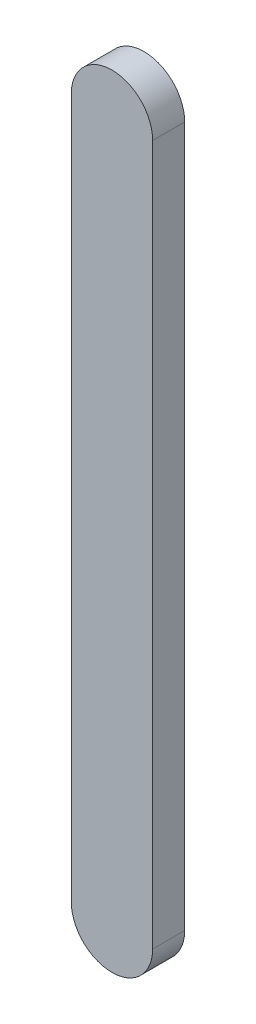
ISO-10303-21;
HEADER;
FILE_DESCRIPTION(('STEP AP214'),'2;1');
FILE_NAME('part.step','',(''),(''),'','','');
FILE_SCHEMA(('AUTOMOTIVE_DESIGN { 1 0 10303 214 1 1 1 1 }'));
ENDSEC;
DATA;
#1=APPLICATION_CONTEXT('core data for automotive mechanical design processes');
#2=APPLICATION_PROTOCOL_DEFINITION('international standard','automotive_design',2000,#1);
#3=PRODUCT_CONTEXT('',#1,'mechanical');
#4=PRODUCT('Part','Part','',(#3));
#5=PRODUCT_RELATED_PRODUCT_CATEGORY('part','',(#4));
#6=PRODUCT_DEFINITION_FORMATION('','',#4);
#7=PRODUCT_DEFINITION_CONTEXT('part definition',#1,'design');
#8=PRODUCT_DEFINITION('design','',#6,#7);
#9=PRODUCT_DEFINITION_SHAPE('','',#8);
#10=(LENGTH_UNIT() NAMED_UNIT(*) SI_UNIT(.MILLI.,.METRE.));
#11=(NAMED_UNIT(*) PLANE_ANGLE_UNIT() SI_UNIT($,.RADIAN.));
#12=(NAMED_UNIT(*) SI_UNIT($,.STERADIAN.) SOLID_ANGLE_UNIT());
#13=UNCERTAINTY_MEASURE_WITH_UNIT(LENGTH_MEASURE(1.E-05),#10,'distance_accuracy_value','');
#14=(GEOMETRIC_REPRESENTATION_CONTEXT(3) GLOBAL_UNCERTAINTY_ASSIGNED_CONTEXT((#13)) GLOBAL_UNIT_ASSIGNED_CONTEXT((#10,
#11,#12)) REPRESENTATION_CONTEXT('',''));
#15=CARTESIAN_POINT('',(0.,0.,0.));
#16=DIRECTION('',(0.,0.,1.));
#17=DIRECTION('',(1.,0.,0.));
#18=AXIS2_PLACEMENT_3D('',#15,#16,#17);
#19=CARTESIAN_POINT('',(147.8788,102.4352028,0.));
#20=DIRECTION('',(-1.,0.,0.));
#21=DIRECTION('',(0.,1.,0.));
#22=AXIS2_PLACEMENT_3D('',#19,#20,#21);
#23=PLANE('',#22);
#24=DIRECTION('',(0.,1.,0.));
#25=VECTOR('',#24,1.);
#26=CARTESIAN_POINT('',(147.8788,102.4352028,0.1999996));
#27=LINE('',#26,#25);
#28=CARTESIAN_POINT('',(147.8788,102.4352028,0.1999996));
#29=VERTEX_POINT('',#28);
#30=CARTESIAN_POINT('',(147.8788,106.807,0.1999996));
#31=VERTEX_POINT('',#30);
#32=EDGE_CURVE('E11',#29,#31,#27,.T.);
#33=ORIENTED_EDGE('',*,*,#32,.F.);
#34=DIRECTION('',(0.,0.,1.));
#35=VECTOR('',#34,1.);
#36=CARTESIAN_POINT('',(147.8788,102.4352028,0.));
#37=LINE('',#36,#35);
#38=CARTESIAN_POINT('',(147.8788,102.4352028,0.));
#39=VERTEX_POINT('',#38);
#40=EDGE_CURVE('E24',#39,#29,#37,.T.);
#41=ORIENTED_EDGE('',*,*,#40,.F.);
#42=DIRECTION('',(0.,1.,0.));
#43=VECTOR('',#42,1.);
#44=CARTESIAN_POINT('',(147.8788,102.4352028,0.));
#45=LINE('',#44,#43);
#46=CARTESIAN_POINT('',(147.8788,106.807,0.));
#47=VERTEX_POINT('',#46);
#48=EDGE_CURVE('E75',#39,#47,#45,.T.);
#49=ORIENTED_EDGE('',*,*,#48,.T.);
#50=DIRECTION('',(0.,0.,1.));
#51=VECTOR('',#50,1.);
#52=CARTESIAN_POINT('',(147.8788,106.807,0.));
#53=LINE('',#52,#51);
#54=EDGE_CURVE('E37',#47,#31,#53,.T.);
#55=ORIENTED_EDGE('',*,*,#54,.T.);
#56=EDGE_LOOP('',(#33,#41,#49,#55));
#57=FACE_BOUND('',#56,.T.);
#58=ADVANCED_FACE('F17',(#57),#23,.F.);
#59=CARTESIAN_POINT('',(147.6248,106.807,0.));
#60=DIRECTION('',(0.,0.,-1.));
#61=DIRECTION('',(1.,0.,0.));
#62=AXIS2_PLACEMENT_3D('',#59,#60,#61);
#63=CYLINDRICAL_SURFACE('',#62,0.25400000000001);
#64=CARTESIAN_POINT('',(147.6248,106.807,0.1999996));
#65=DIRECTION('',(0.,0.,1.));
#66=DIRECTION('',(1.,0.,0.));
#67=AXIS2_PLACEMENT_3D('',#64,#65,#66);
#68=CIRCLE('',#67,0.25400000000001);
#69=CARTESIAN_POINT('',(147.3708,106.807,0.1999996));
#70=VERTEX_POINT('',#69);
#71=EDGE_CURVE('E83',#31,#70,#68,.T.);
#72=ORIENTED_EDGE('',*,*,#71,.F.);
#73=ORIENTED_EDGE('',*,*,#54,.F.);
#74=CARTESIAN_POINT('',(147.6248,106.807,0.));
#75=DIRECTION('',(0.,0.,1.));
#76=DIRECTION('',(1.,0.,0.));
#77=AXIS2_PLACEMENT_3D('',#74,#75,#76);
#78=CIRCLE('',#77,0.25400000000001);
#79=CARTESIAN_POINT('',(147.3708,106.807,0.));
#80=VERTEX_POINT('',#79);
#81=EDGE_CURVE('E81',#47,#80,#78,.T.);
#82=ORIENTED_EDGE('',*,*,#81,.T.);
#83=DIRECTION('',(0.,0.,1.));
#84=VECTOR('',#83,1.);
#85=CARTESIAN_POINT('',(147.3708,106.807,0.));
#86=LINE('',#85,#84);
#87=EDGE_CURVE('E67',#80,#70,#86,.T.);
#88=ORIENTED_EDGE('',*,*,#87,.T.);
#89=EDGE_LOOP('',(#72,#73,#82,#88));
#90=FACE_BOUND('',#89,.T.);
#91=ADVANCED_FACE('F89',(#90),#63,.T.);
#92=CARTESIAN_POINT('',(147.3708,106.807,0.));
#93=DIRECTION('',(1.,0.,0.));
#94=DIRECTION('',(0.,-1.,0.));
#95=AXIS2_PLACEMENT_3D('',#92,#93,#94);
#96=PLANE('',#95);
#97=DIRECTION('',(0.,-1.,0.));
#98=VECTOR('',#97,1.);
#99=CARTESIAN_POINT('',(147.3708,106.807,0.1999996));
#100=LINE('',#99,#98);
#101=CARTESIAN_POINT('',(147.3708,102.4352028,0.1999996));
#102=VERTEX_POINT('',#101);
#103=EDGE_CURVE('E71',#70,#102,#100,.T.);
#104=ORIENTED_EDGE('',*,*,#103,.F.);
#105=ORIENTED_EDGE('',*,*,#87,.F.);
#106=DIRECTION('',(0.,-1.,0.));
#107=VECTOR('',#106,1.);
#108=CARTESIAN_POINT('',(147.3708,106.807,0.));
#109=LINE('',#108,#107);
#110=CARTESIAN_POINT('',(147.3708,102.4352028,0.));
#111=VERTEX_POINT('',#110);
#112=EDGE_CURVE('E63',#80,#111,#109,.T.);
#113=ORIENTED_EDGE('',*,*,#112,.T.);
#114=DIRECTION('',(0.,0.,1.));
#115=VECTOR('',#114,1.);
#116=CARTESIAN_POINT('',(147.3708,102.4352028,0.));
#117=LINE('',#116,#115);
#118=EDGE_CURVE('E53',#111,#102,#117,.T.);
#119=ORIENTED_EDGE('',*,*,#118,.T.);
#120=EDGE_LOOP('',(#104,#105,#113,#119));
#121=FACE_BOUND('',#120,.T.);
#122=ADVANCED_FACE('F66',(#121),#96,.F.);
#123=CARTESIAN_POINT('',(147.6248,102.4352028,0.));
#124=DIRECTION('',(0.,0.,-1.));
#125=DIRECTION('',(-1.,0.,0.));
#126=AXIS2_PLACEMENT_3D('',#123,#124,#125);
#127=CYLINDRICAL_SURFACE('',#126,0.25400000000001);
#128=CARTESIAN_POINT('',(147.6248,102.4352028,0.1999996));
#129=DIRECTION('',(0.,0.,1.));
#130=DIRECTION('',(-1.,0.,0.));
#131=AXIS2_PLACEMENT_3D('',#128,#129,#130);
#132=CIRCLE('',#131,0.25400000000001);
#133=EDGE_CURVE('E59',#102,#29,#132,.T.);
#134=ORIENTED_EDGE('',*,*,#133,.F.);
#135=ORIENTED_EDGE('',*,*,#118,.F.);
#136=CARTESIAN_POINT('',(147.6248,102.4352028,0.));
#137=DIRECTION('',(0.,0.,1.));
#138=DIRECTION('',(-1.,0.,0.));
#139=AXIS2_PLACEMENT_3D('',#136,#137,#138);
#140=CIRCLE('',#139,0.25400000000001);
#141=EDGE_CURVE('E57',#111,#39,#140,.T.);
#142=ORIENTED_EDGE('',*,*,#141,.T.);
#143=ORIENTED_EDGE('',*,*,#40,.T.);
#144=EDGE_LOOP('',(#134,#135,#142,#143));
#145=FACE_BOUND('',#144,.T.);
#146=ADVANCED_FACE('F55',(#145),#127,.T.);
#147=CARTESIAN_POINT('',(147.8788,102.4352028,0.));
#148=DIRECTION('',(0.,0.,-1.));
#149=DIRECTION('',(-1.,0.,0.));
#150=AXIS2_PLACEMENT_3D('',#147,#148,#149);
#151=PLANE('',#150);
#152=ORIENTED_EDGE('',*,*,#141,.F.);
#153=ORIENTED_EDGE('',*,*,#112,.F.);
#154=ORIENTED_EDGE('',*,*,#81,.F.);
#155=ORIENTED_EDGE('',*,*,#48,.F.);
#156=EDGE_LOOP('',(#152,#153,#154,#155));
#157=FACE_BOUND('',#156,.T.);
#158=ADVANCED_FACE('F74',(#157),#151,.T.);
#159=CARTESIAN_POINT('',(147.8788,102.4352028,0.1999996));
#160=DIRECTION('',(0.,0.,-1.));
#161=DIRECTION('',(-1.,0.,0.));
#162=AXIS2_PLACEMENT_3D('',#159,#160,#161);
#163=PLANE('',#162);
#164=ORIENTED_EDGE('',*,*,#32,.T.);
#165=ORIENTED_EDGE('',*,*,#71,.T.);
#166=ORIENTED_EDGE('',*,*,#103,.T.);
#167=ORIENTED_EDGE('',*,*,#133,.T.);
#168=EDGE_LOOP('',(#164,#165,#166,#167));
#169=FACE_BOUND('',#168,.T.);
#170=ADVANCED_FACE('F91',(#169),#163,.F.);
#171=CLOSED_SHELL('',(#58,#91,#122,#146,#158,#170));
#172=MANIFOLD_SOLID_BREP('B1',#171);
#173=ADVANCED_BREP_SHAPE_REPRESENTATION('',(#18,#172),#14);
#174=SHAPE_DEFINITION_REPRESENTATION(#9,#173);
ENDSEC;
END-ISO-10303-21;
